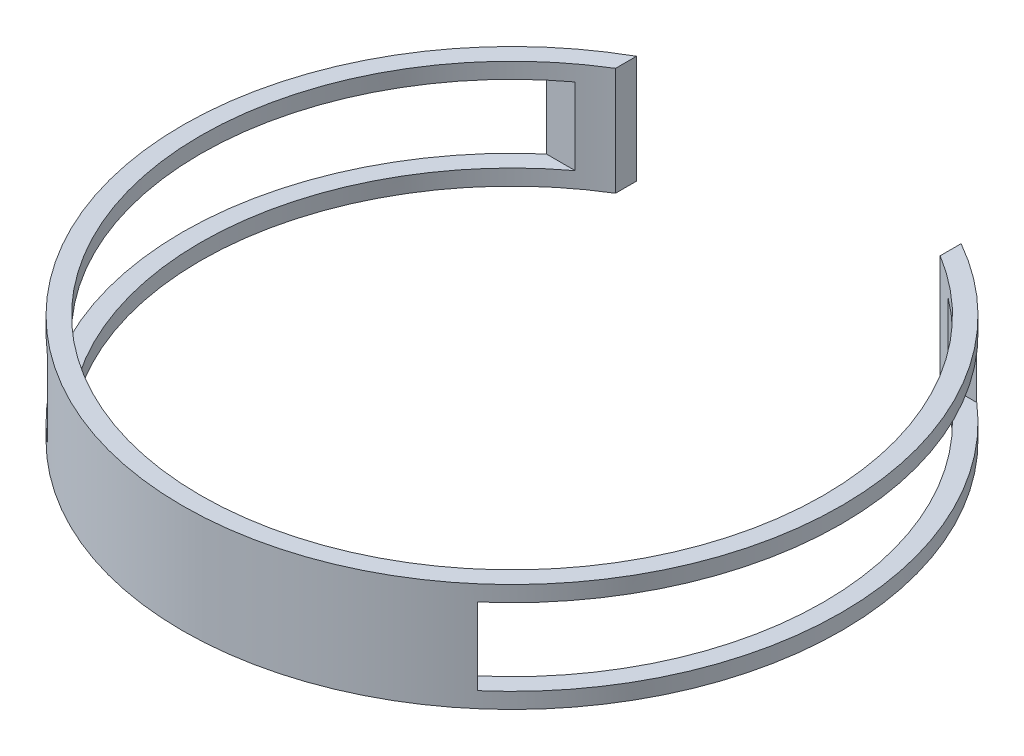
ISO-10303-21;
HEADER;
FILE_DESCRIPTION(('STEP AP214'),'2;1');
FILE_NAME('part.step','',(''),(''),'','','');
FILE_SCHEMA(('AUTOMOTIVE_DESIGN { 1 0 10303 214 1 1 1 1 }'));
ENDSEC;
DATA;
#1=APPLICATION_CONTEXT('core data for automotive mechanical design processes');
#2=APPLICATION_PROTOCOL_DEFINITION('international standard','automotive_design',2000,#1);
#3=PRODUCT_CONTEXT('',#1,'mechanical');
#4=PRODUCT('Part','Part','',(#3));
#5=PRODUCT_RELATED_PRODUCT_CATEGORY('part','',(#4));
#6=PRODUCT_DEFINITION_FORMATION('','',#4);
#7=PRODUCT_DEFINITION_CONTEXT('part definition',#1,'design');
#8=PRODUCT_DEFINITION('design','',#6,#7);
#9=PRODUCT_DEFINITION_SHAPE('','',#8);
#10=(LENGTH_UNIT() NAMED_UNIT(*) SI_UNIT(.MILLI.,.METRE.));
#11=(NAMED_UNIT(*) PLANE_ANGLE_UNIT() SI_UNIT($,.RADIAN.));
#12=(NAMED_UNIT(*) SI_UNIT($,.STERADIAN.) SOLID_ANGLE_UNIT());
#13=UNCERTAINTY_MEASURE_WITH_UNIT(LENGTH_MEASURE(1.E-05),#10,'distance_accuracy_value','');
#14=(GEOMETRIC_REPRESENTATION_CONTEXT(3) GLOBAL_UNCERTAINTY_ASSIGNED_CONTEXT((#13)) GLOBAL_UNIT_ASSIGNED_CONTEXT((#10,
#11,#12)) REPRESENTATION_CONTEXT('',''));
#15=CARTESIAN_POINT('',(0.,0.,0.));
#16=DIRECTION('',(0.,0.,1.));
#17=DIRECTION('',(1.,0.,0.));
#18=AXIS2_PLACEMENT_3D('',#15,#16,#17);
#19=CARTESIAN_POINT('',(0.,15.,0.));
#20=DIRECTION('',(0.,1.,0.));
#21=DIRECTION('',(0.,0.,1.));
#22=AXIS2_PLACEMENT_3D('',#19,#20,#21);
#23=PLANE('',#22);
#24=DIRECTION('',(0.,0.,1.));
#25=VECTOR('',#24,1.);
#26=CARTESIAN_POINT('',(45.,15.,-91.355));
#27=LINE('',#26,#25);
#28=CARTESIAN_POINT('',(45.,15.,-79.5030567022426));
#29=VERTEX_POINT('',#28);
#30=CARTESIAN_POINT('',(45.,15.,-73.7033650859986));
#31=VERTEX_POINT('',#30);
#32=EDGE_CURVE('E220',#29,#31,#27,.T.);
#33=ORIENTED_EDGE('',*,*,#32,.T.);
#34=CARTESIAN_POINT('',(0.,15.,0.));
#35=DIRECTION('',(0.,1.,0.));
#36=DIRECTION('',(0.,0.,1.));
#37=AXIS2_PLACEMENT_3D('',#34,#35,#36);
#38=CIRCLE('',#37,86.355);
#39=CARTESIAN_POINT('',(-45.,15.,-73.7033650859986));
#40=VERTEX_POINT('',#39);
#41=EDGE_CURVE('E243',#40,#31,#38,.T.);
#42=ORIENTED_EDGE('',*,*,#41,.F.);
#43=DIRECTION('',(0.,0.,1.));
#44=VECTOR('',#43,1.);
#45=CARTESIAN_POINT('',(-45.,15.,-91.355));
#46=LINE('',#45,#44);
#47=CARTESIAN_POINT('',(-45.,15.,-79.5030567022426));
#48=VERTEX_POINT('',#47);
#49=EDGE_CURVE('E229',#48,#40,#46,.T.);
#50=ORIENTED_EDGE('',*,*,#49,.F.);
#51=CARTESIAN_POINT('',(0.,15.,0.));
#52=DIRECTION('',(0.,1.,0.));
#53=DIRECTION('',(0.,0.,1.));
#54=AXIS2_PLACEMENT_3D('',#51,#52,#53);
#55=CIRCLE('',#54,91.355);
#56=EDGE_CURVE('E251',#48,#29,#55,.T.);
#57=ORIENTED_EDGE('',*,*,#56,.T.);
#58=EDGE_LOOP('',(#33,#42,#50,#57));
#59=FACE_BOUND('',#58,.T.);
#60=ADVANCED_FACE('F39',(#59),#23,.T.);
#61=CARTESIAN_POINT('',(0.,-15.,0.));
#62=DIRECTION('',(0.,1.,0.));
#63=DIRECTION('',(0.,0.,1.));
#64=AXIS2_PLACEMENT_3D('',#61,#62,#63);
#65=PLANE('',#64);
#66=CARTESIAN_POINT('',(0.,-15.,0.));
#67=DIRECTION('',(0.,1.,0.));
#68=DIRECTION('',(0.,0.,1.));
#69=AXIS2_PLACEMENT_3D('',#66,#67,#68);
#70=CIRCLE('',#69,86.355);
#71=CARTESIAN_POINT('',(-45.,-15.,-73.7033650859986));
#72=VERTEX_POINT('',#71);
#73=CARTESIAN_POINT('',(45.,-15.,-73.7033650859986));
#74=VERTEX_POINT('',#73);
#75=EDGE_CURVE('E242',#72,#74,#70,.T.);
#76=ORIENTED_EDGE('',*,*,#75,.T.);
#77=DIRECTION('',(0.,0.,1.));
#78=VECTOR('',#77,1.);
#79=CARTESIAN_POINT('',(45.,-15.,-91.355));
#80=LINE('',#79,#78);
#81=CARTESIAN_POINT('',(45.,-15.,-79.5030567022426));
#82=VERTEX_POINT('',#81);
#83=EDGE_CURVE('E221',#82,#74,#80,.T.);
#84=ORIENTED_EDGE('',*,*,#83,.F.);
#85=CARTESIAN_POINT('',(0.,-15.,0.));
#86=DIRECTION('',(0.,1.,0.));
#87=DIRECTION('',(0.,0.,1.));
#88=AXIS2_PLACEMENT_3D('',#85,#86,#87);
#89=CIRCLE('',#88,91.355);
#90=CARTESIAN_POINT('',(-45.,-15.,-79.5030567022426));
#91=VERTEX_POINT('',#90);
#92=EDGE_CURVE('E247',#91,#82,#89,.T.);
#93=ORIENTED_EDGE('',*,*,#92,.F.);
#94=DIRECTION('',(0.,0.,1.));
#95=VECTOR('',#94,1.);
#96=CARTESIAN_POINT('',(-45.,-15.,-91.355));
#97=LINE('',#96,#95);
#98=EDGE_CURVE('E225',#91,#72,#97,.T.);
#99=ORIENTED_EDGE('',*,*,#98,.T.);
#100=EDGE_LOOP('',(#76,#84,#93,#99));
#101=FACE_BOUND('',#100,.T.);
#102=ADVANCED_FACE('F275',(#101),#65,.F.);
#103=CARTESIAN_POINT('',(0.,15.,0.));
#104=DIRECTION('',(0.,-1.,0.));
#105=DIRECTION('',(0.,0.,-1.));
#106=AXIS2_PLACEMENT_3D('',#103,#104,#105);
#107=CYLINDRICAL_SURFACE('',#106,91.355);
#108=DIRECTION('',(0.,-1.,0.));
#109=VECTOR('',#108,1.);
#110=CARTESIAN_POINT('',(-59.6576132835354,15.,69.1860188355432));
#111=LINE('',#110,#109);
#112=CARTESIAN_POINT('',(-59.6576132835354,10.6440028977759,69.1860188355432));
#113=VERTEX_POINT('',#112);
#114=CARTESIAN_POINT('',(-59.6576132835354,-10.6440028977759,69.1860188355432));
#115=VERTEX_POINT('',#114);
#116=EDGE_CURVE('E217',#113,#115,#111,.T.);
#117=ORIENTED_EDGE('',*,*,#116,.T.);
#118=CARTESIAN_POINT('',(0.,-10.6440028977759,0.));
#119=DIRECTION('',(0.,-1.,0.));
#120=DIRECTION('',(0.,0.,-1.));
#121=AXIS2_PLACEMENT_3D('',#118,#119,#120);
#122=CIRCLE('',#121,91.355);
#123=CARTESIAN_POINT('',(-59.6576132835354,-10.6440028977759,-69.1860188355432));
#124=VERTEX_POINT('',#123);
#125=EDGE_CURVE('E55',#115,#124,#122,.T.);
#126=ORIENTED_EDGE('',*,*,#125,.T.);
#127=DIRECTION('',(0.,-1.,0.));
#128=VECTOR('',#127,1.);
#129=CARTESIAN_POINT('',(-59.6576132835354,15.,-69.1860188355432));
#130=LINE('',#129,#128);
#131=CARTESIAN_POINT('',(-59.6576132835354,10.6440028977759,-69.1860188355432));
#132=VERTEX_POINT('',#131);
#133=EDGE_CURVE('E149',#124,#132,#130,.F.);
#134=ORIENTED_EDGE('',*,*,#133,.T.);
#135=CARTESIAN_POINT('',(0.,10.6440028977759,0.));
#136=DIRECTION('',(0.,1.,0.));
#137=DIRECTION('',(0.,0.,1.));
#138=AXIS2_PLACEMENT_3D('',#135,#136,#137);
#139=CIRCLE('',#138,91.355);
#140=EDGE_CURVE('E211',#132,#113,#139,.T.);
#141=ORIENTED_EDGE('',*,*,#140,.T.);
#142=EDGE_LOOP('',(#117,#126,#134,#141));
#143=FACE_BOUND('',#142,.T.);
#144=DIRECTION('',(0.,-1.,0.));
#145=VECTOR('',#144,1.);
#146=CARTESIAN_POINT('',(59.6576132835354,15.,-69.1860188355432));
#147=LINE('',#146,#145);
#148=CARTESIAN_POINT('',(59.6576132835354,10.6440028977759,-69.1860188355432));
#149=VERTEX_POINT('',#148);
#150=CARTESIAN_POINT('',(59.6576132835354,-10.6440028977759,-69.1860188355432));
#151=VERTEX_POINT('',#150);
#152=EDGE_CURVE('E197',#149,#151,#147,.T.);
#153=ORIENTED_EDGE('',*,*,#152,.T.);
#154=CARTESIAN_POINT('',(59.6576132835354,-10.6440028977759,69.1860188355432));
#155=VERTEX_POINT('',#154);
#156=EDGE_CURVE('E63',#151,#155,#122,.T.);
#157=ORIENTED_EDGE('',*,*,#156,.T.);
#158=DIRECTION('',(0.,-1.,0.));
#159=VECTOR('',#158,1.);
#160=CARTESIAN_POINT('',(59.6576132835354,15.,69.1860188355432));
#161=LINE('',#160,#159);
#162=CARTESIAN_POINT('',(59.6576132835354,10.6440028977759,69.1860188355432));
#163=VERTEX_POINT('',#162);
#164=EDGE_CURVE('E187',#155,#163,#161,.F.);
#165=ORIENTED_EDGE('',*,*,#164,.T.);
#166=EDGE_CURVE('E212',#163,#149,#139,.T.);
#167=ORIENTED_EDGE('',*,*,#166,.T.);
#168=EDGE_LOOP('',(#153,#157,#165,#167));
#169=FACE_BOUND('',#168,.T.);
#170=ORIENTED_EDGE('',*,*,#92,.T.);
#171=DIRECTION('',(0.,-1.,0.));
#172=VECTOR('',#171,1.);
#173=CARTESIAN_POINT('',(45.,15.,-79.5030567022426));
#174=LINE('',#173,#172);
#175=EDGE_CURVE('E238',#82,#29,#174,.F.);
#176=ORIENTED_EDGE('',*,*,#175,.T.);
#177=ORIENTED_EDGE('',*,*,#56,.F.);
#178=DIRECTION('',(0.,-1.,0.));
#179=VECTOR('',#178,1.);
#180=CARTESIAN_POINT('',(-45.,15.,-79.5030567022426));
#181=LINE('',#180,#179);
#182=EDGE_CURVE('E224',#48,#91,#181,.T.);
#183=ORIENTED_EDGE('',*,*,#182,.T.);
#184=EDGE_LOOP('',(#170,#176,#177,#183));
#185=FACE_BOUND('',#184,.T.);
#186=ADVANCED_FACE('F41',(#143,#169,#185),#107,.T.);
#187=CARTESIAN_POINT('',(0.,15.,0.));
#188=DIRECTION('',(0.,-1.,0.));
#189=DIRECTION('',(0.,0.,-1.));
#190=AXIS2_PLACEMENT_3D('',#187,#188,#189);
#191=CYLINDRICAL_SURFACE('',#190,86.355);
#192=DIRECTION('',(0.,-1.,0.));
#193=VECTOR('',#192,1.);
#194=CARTESIAN_POINT('',(51.6766951602737,15.,69.1860188355432));
#195=LINE('',#194,#193);
#196=CARTESIAN_POINT('',(51.6766951602737,-10.6440028977759,69.1860188355432));
#197=VERTEX_POINT('',#196);
#198=CARTESIAN_POINT('',(51.6766951602737,10.6440028977759,69.1860188355432));
#199=VERTEX_POINT('',#198);
#200=EDGE_CURVE('E11',#197,#199,#195,.F.);
#201=ORIENTED_EDGE('',*,*,#200,.F.);
#202=CARTESIAN_POINT('',(0.,-10.6440028977759,0.));
#203=DIRECTION('',(0.,-1.,0.));
#204=DIRECTION('',(0.,0.,-1.));
#205=AXIS2_PLACEMENT_3D('',#202,#203,#204);
#206=CIRCLE('',#205,86.355);
#207=CARTESIAN_POINT('',(51.6766951602738,-10.6440028977759,-69.1860188355432));
#208=VERTEX_POINT('',#207);
#209=EDGE_CURVE('E144',#208,#197,#206,.T.);
#210=ORIENTED_EDGE('',*,*,#209,.F.);
#211=DIRECTION('',(0.,-1.,0.));
#212=VECTOR('',#211,1.);
#213=CARTESIAN_POINT('',(51.6766951602738,15.,-69.1860188355432));
#214=LINE('',#213,#212);
#215=CARTESIAN_POINT('',(51.6766951602737,10.6440028977759,-69.1860188355432));
#216=VERTEX_POINT('',#215);
#217=EDGE_CURVE('E166',#216,#208,#214,.T.);
#218=ORIENTED_EDGE('',*,*,#217,.F.);
#219=CARTESIAN_POINT('',(0.,10.6440028977759,0.));
#220=DIRECTION('',(0.,1.,0.));
#221=DIRECTION('',(0.,0.,1.));
#222=AXIS2_PLACEMENT_3D('',#219,#220,#221);
#223=CIRCLE('',#222,86.355);
#224=EDGE_CURVE('E48',#199,#216,#223,.T.);
#225=ORIENTED_EDGE('',*,*,#224,.F.);
#226=EDGE_LOOP('',(#201,#210,#218,#225));
#227=FACE_BOUND('',#226,.T.);
#228=DIRECTION('',(0.,-1.,0.));
#229=VECTOR('',#228,1.);
#230=CARTESIAN_POINT('',(-51.6766951602737,15.,69.1860188355432));
#231=LINE('',#230,#229);
#232=CARTESIAN_POINT('',(-51.6766951602737,10.6440028977759,69.1860188355432));
#233=VERTEX_POINT('',#232);
#234=CARTESIAN_POINT('',(-51.6766951602737,-10.6440028977759,69.1860188355432));
#235=VERTEX_POINT('',#234);
#236=EDGE_CURVE('E161',#233,#235,#231,.T.);
#237=ORIENTED_EDGE('',*,*,#236,.F.);
#238=CARTESIAN_POINT('',(-51.6766951602738,10.6440028977759,-69.1860188355432));
#239=VERTEX_POINT('',#238);
#240=EDGE_CURVE('E157',#239,#233,#223,.T.);
#241=ORIENTED_EDGE('',*,*,#240,.F.);
#242=DIRECTION('',(0.,-1.,0.));
#243=VECTOR('',#242,1.);
#244=CARTESIAN_POINT('',(-51.6766951602738,15.,-69.1860188355432));
#245=LINE('',#244,#243);
#246=CARTESIAN_POINT('',(-51.6766951602738,-10.6440028977759,-69.1860188355432));
#247=VERTEX_POINT('',#246);
#248=EDGE_CURVE('E141',#247,#239,#245,.F.);
#249=ORIENTED_EDGE('',*,*,#248,.F.);
#250=EDGE_CURVE('E129',#235,#247,#206,.T.);
#251=ORIENTED_EDGE('',*,*,#250,.F.);
#252=EDGE_LOOP('',(#237,#241,#249,#251));
#253=FACE_BOUND('',#252,.T.);
#254=DIRECTION('',(0.,-1.,0.));
#255=VECTOR('',#254,1.);
#256=CARTESIAN_POINT('',(45.,15.,-73.7033650859986));
#257=LINE('',#256,#255);
#258=EDGE_CURVE('E142',#74,#31,#257,.F.);
#259=ORIENTED_EDGE('',*,*,#258,.F.);
#260=ORIENTED_EDGE('',*,*,#75,.F.);
#261=DIRECTION('',(0.,-1.,0.));
#262=VECTOR('',#261,1.);
#263=CARTESIAN_POINT('',(-45.,15.,-73.7033650859986));
#264=LINE('',#263,#262);
#265=EDGE_CURVE('E255',#40,#72,#264,.T.);
#266=ORIENTED_EDGE('',*,*,#265,.F.);
#267=ORIENTED_EDGE('',*,*,#41,.T.);
#268=EDGE_LOOP('',(#259,#260,#266,#267));
#269=FACE_BOUND('',#268,.T.);
#270=ADVANCED_FACE('F155',(#227,#253,#269),#191,.F.);
#271=CARTESIAN_POINT('',(-45.,-15.,-91.355));
#272=DIRECTION('',(-1.,0.,0.));
#273=DIRECTION('',(0.,0.,1.));
#274=AXIS2_PLACEMENT_3D('',#271,#272,#273);
#275=PLANE('',#274);
#276=ORIENTED_EDGE('',*,*,#49,.T.);
#277=ORIENTED_EDGE('',*,*,#265,.T.);
#278=ORIENTED_EDGE('',*,*,#98,.F.);
#279=ORIENTED_EDGE('',*,*,#182,.F.);
#280=EDGE_LOOP('',(#276,#277,#278,#279));
#281=FACE_BOUND('',#280,.T.);
#282=ADVANCED_FACE('F272',(#281),#275,.F.);
#283=CARTESIAN_POINT('',(45.,-15.,-91.355));
#284=DIRECTION('',(1.,0.,0.));
#285=DIRECTION('',(0.,0.,-1.));
#286=AXIS2_PLACEMENT_3D('',#283,#284,#285);
#287=PLANE('',#286);
#288=ORIENTED_EDGE('',*,*,#83,.T.);
#289=ORIENTED_EDGE('',*,*,#258,.T.);
#290=ORIENTED_EDGE('',*,*,#32,.F.);
#291=ORIENTED_EDGE('',*,*,#175,.F.);
#292=EDGE_LOOP('',(#288,#289,#290,#291));
#293=FACE_BOUND('',#292,.T.);
#294=ADVANCED_FACE('F263',(#293),#287,.F.);
#295=CARTESIAN_POINT('',(-91.355,-10.6440028977759,-69.1860188355432));
#296=DIRECTION('',(0.,-1.,0.));
#297=DIRECTION('',(0.,0.,-1.));
#298=AXIS2_PLACEMENT_3D('',#295,#296,#297);
#299=PLANE('',#298);
#300=DIRECTION('',(1.,0.,0.));
#301=VECTOR('',#300,1.);
#302=CARTESIAN_POINT('',(-91.355,-10.6440028977759,69.1860188355432));
#303=LINE('',#302,#301);
#304=EDGE_CURVE('E135',#115,#235,#303,.T.);
#305=ORIENTED_EDGE('',*,*,#304,.T.);
#306=ORIENTED_EDGE('',*,*,#250,.T.);
#307=DIRECTION('',(1.,0.,0.));
#308=VECTOR('',#307,1.);
#309=CARTESIAN_POINT('',(-91.355,-10.6440028977759,-69.1860188355432));
#310=LINE('',#309,#308);
#311=EDGE_CURVE('E132',#124,#247,#310,.T.);
#312=ORIENTED_EDGE('',*,*,#311,.F.);
#313=ORIENTED_EDGE('',*,*,#125,.F.);
#314=EDGE_LOOP('',(#305,#306,#312,#313));
#315=FACE_BOUND('',#314,.T.);
#316=ADVANCED_FACE('F131',(#315),#299,.F.);
#317=CARTESIAN_POINT('',(-91.355,-10.6440028977759,-69.1860188355432));
#318=DIRECTION('',(0.,0.,-1.));
#319=DIRECTION('',(-1.,0.,0.));
#320=AXIS2_PLACEMENT_3D('',#317,#318,#319);
#321=PLANE('',#320);
#322=ORIENTED_EDGE('',*,*,#311,.T.);
#323=ORIENTED_EDGE('',*,*,#248,.T.);
#324=DIRECTION('',(1.,0.,0.));
#325=VECTOR('',#324,1.);
#326=CARTESIAN_POINT('',(-91.355,10.6440028977759,-69.1860188355432));
#327=LINE('',#326,#325);
#328=EDGE_CURVE('E199',#132,#239,#327,.T.);
#329=ORIENTED_EDGE('',*,*,#328,.F.);
#330=ORIENTED_EDGE('',*,*,#133,.F.);
#331=EDGE_LOOP('',(#322,#323,#329,#330));
#332=FACE_BOUND('',#331,.T.);
#333=ADVANCED_FACE('F146',(#332),#321,.F.);
#334=CARTESIAN_POINT('',(-91.355,10.6440028977759,-69.1860188355432));
#335=DIRECTION('',(0.,1.,0.));
#336=DIRECTION('',(0.,0.,1.));
#337=AXIS2_PLACEMENT_3D('',#334,#335,#336);
#338=PLANE('',#337);
#339=ORIENTED_EDGE('',*,*,#328,.T.);
#340=ORIENTED_EDGE('',*,*,#240,.T.);
#341=DIRECTION('',(1.,0.,0.));
#342=VECTOR('',#341,1.);
#343=CARTESIAN_POINT('',(-91.355,10.6440028977759,69.1860188355432));
#344=LINE('',#343,#342);
#345=EDGE_CURVE('E314',#113,#233,#344,.T.);
#346=ORIENTED_EDGE('',*,*,#345,.F.);
#347=ORIENTED_EDGE('',*,*,#140,.F.);
#348=EDGE_LOOP('',(#339,#340,#346,#347));
#349=FACE_BOUND('',#348,.T.);
#350=ADVANCED_FACE('F295',(#349),#338,.F.);
#351=CARTESIAN_POINT('',(-91.355,-10.6440028977759,69.1860188355432));
#352=DIRECTION('',(0.,0.,1.));
#353=DIRECTION('',(1.,0.,0.));
#354=AXIS2_PLACEMENT_3D('',#351,#352,#353);
#355=PLANE('',#354);
#356=ORIENTED_EDGE('',*,*,#345,.T.);
#357=ORIENTED_EDGE('',*,*,#236,.T.);
#358=ORIENTED_EDGE('',*,*,#304,.F.);
#359=ORIENTED_EDGE('',*,*,#116,.F.);
#360=EDGE_LOOP('',(#356,#357,#358,#359));
#361=FACE_BOUND('',#360,.T.);
#362=ADVANCED_FACE('F292',(#361),#355,.F.);
#363=EDGE_CURVE('E179',#197,#155,#303,.T.);
#364=ORIENTED_EDGE('',*,*,#363,.F.);
#365=ORIENTED_EDGE('',*,*,#200,.T.);
#366=EDGE_CURVE('E194',#199,#163,#344,.T.);
#367=ORIENTED_EDGE('',*,*,#366,.T.);
#368=ORIENTED_EDGE('',*,*,#164,.F.);
#369=EDGE_LOOP('',(#364,#365,#367,#368));
#370=FACE_BOUND('',#369,.T.);
#371=ADVANCED_FACE('F184',(#370),#355,.F.);
#372=ORIENTED_EDGE('',*,*,#366,.F.);
#373=ORIENTED_EDGE('',*,*,#224,.T.);
#374=EDGE_CURVE('E151',#216,#149,#327,.T.);
#375=ORIENTED_EDGE('',*,*,#374,.T.);
#376=ORIENTED_EDGE('',*,*,#166,.F.);
#377=EDGE_LOOP('',(#372,#373,#375,#376));
#378=FACE_BOUND('',#377,.T.);
#379=ADVANCED_FACE('F193',(#378),#338,.F.);
#380=ORIENTED_EDGE('',*,*,#374,.F.);
#381=ORIENTED_EDGE('',*,*,#217,.T.);
#382=EDGE_CURVE('E152',#208,#151,#310,.T.);
#383=ORIENTED_EDGE('',*,*,#382,.T.);
#384=ORIENTED_EDGE('',*,*,#152,.F.);
#385=EDGE_LOOP('',(#380,#381,#383,#384));
#386=FACE_BOUND('',#385,.T.);
#387=ADVANCED_FACE('F196',(#386),#321,.F.);
#388=ORIENTED_EDGE('',*,*,#382,.F.);
#389=ORIENTED_EDGE('',*,*,#209,.T.);
#390=ORIENTED_EDGE('',*,*,#363,.T.);
#391=ORIENTED_EDGE('',*,*,#156,.F.);
#392=EDGE_LOOP('',(#388,#389,#390,#391));
#393=FACE_BOUND('',#392,.T.);
#394=ADVANCED_FACE('F178',(#393),#299,.F.);
#395=CLOSED_SHELL('',(#60,#102,#186,#270,#282,#294,#316,#333,#350,#362,#371,#379,#387,#394));
#396=MANIFOLD_SOLID_BREP('B2',#395);
#397=ADVANCED_BREP_SHAPE_REPRESENTATION('',(#18,#396),#14);
#398=SHAPE_DEFINITION_REPRESENTATION(#9,#397);
ENDSEC;
END-ISO-10303-21;
